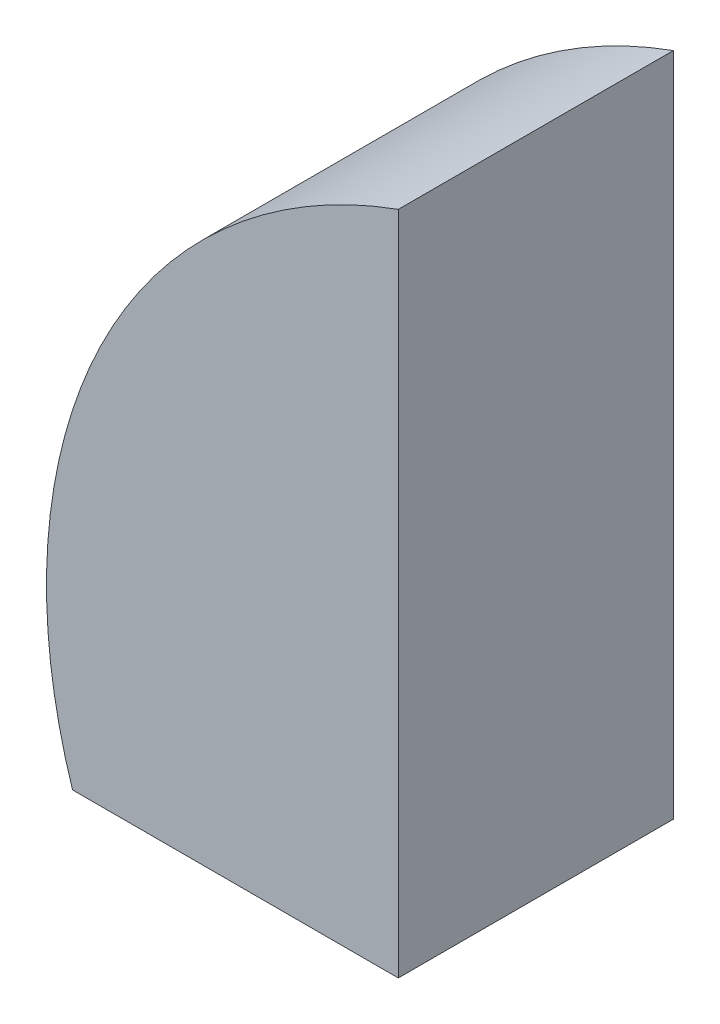
ISO-10303-21;
HEADER;
FILE_DESCRIPTION(('STEP AP214'),'2;1');
FILE_NAME('part.step','',(''),(''),'','','');
FILE_SCHEMA(('AUTOMOTIVE_DESIGN { 1 0 10303 214 1 1 1 1 }'));
ENDSEC;
DATA;
#1=APPLICATION_CONTEXT('core data for automotive mechanical design processes');
#2=APPLICATION_PROTOCOL_DEFINITION('international standard','automotive_design',2000,#1);
#3=PRODUCT_CONTEXT('',#1,'mechanical');
#4=PRODUCT('Part','Part','',(#3));
#5=PRODUCT_RELATED_PRODUCT_CATEGORY('part','',(#4));
#6=PRODUCT_DEFINITION_FORMATION('','',#4);
#7=PRODUCT_DEFINITION_CONTEXT('part definition',#1,'design');
#8=PRODUCT_DEFINITION('design','',#6,#7);
#9=PRODUCT_DEFINITION_SHAPE('','',#8);
#10=(LENGTH_UNIT() NAMED_UNIT(*) SI_UNIT(.MILLI.,.METRE.));
#11=(NAMED_UNIT(*) PLANE_ANGLE_UNIT() SI_UNIT($,.RADIAN.));
#12=(NAMED_UNIT(*) SI_UNIT($,.STERADIAN.) SOLID_ANGLE_UNIT());
#13=UNCERTAINTY_MEASURE_WITH_UNIT(LENGTH_MEASURE(1.E-05),#10,'distance_accuracy_value','');
#14=(GEOMETRIC_REPRESENTATION_CONTEXT(3) GLOBAL_UNCERTAINTY_ASSIGNED_CONTEXT((#13)) GLOBAL_UNIT_ASSIGNED_CONTEXT((#10,
#11,#12)) REPRESENTATION_CONTEXT('',''));
#15=CARTESIAN_POINT('',(0.,0.,0.));
#16=DIRECTION('',(0.,0.,1.));
#17=DIRECTION('',(1.,0.,0.));
#18=AXIS2_PLACEMENT_3D('',#15,#16,#17);
#19=CARTESIAN_POINT('',(-634.999999999999,-5.55111512312578E-13,965.199999999998));
#20=DIRECTION('',(0.999999999999999,0.,0.));
#21=DIRECTION('',(0.,1.,0.));
#22=AXIS2_PLACEMENT_3D('',#19,#20,#21);
#23=PLANE('',#22);
#24=DIRECTION('',(0.,-1.,0.));
#25=VECTOR('',#24,1.);
#26=CARTESIAN_POINT('',(-634.999999999999,-1.11022302462516E-13,0.));
#27=LINE('',#26,#25);
#28=CARTESIAN_POINT('',(-635.,1758.28920078581,0.));
#29=VERTEX_POINT('',#28);
#30=CARTESIAN_POINT('',(-634.999999999999,-577.513561399211,0.));
#31=VERTEX_POINT('',#30);
#32=EDGE_CURVE('E89',#29,#31,#27,.T.);
#33=ORIENTED_EDGE('',*,*,#32,.F.);
#34=DIRECTION('',(0.,0.,-0.999999999999999));
#35=VECTOR('',#34,1.);
#36=CARTESIAN_POINT('',(-635.,1758.28920078581,965.199999999998));
#37=LINE('',#36,#35);
#38=CARTESIAN_POINT('',(-635.,1758.28920078581,965.199999999998));
#39=VERTEX_POINT('',#38);
#40=EDGE_CURVE('E13',#39,#29,#37,.T.);
#41=ORIENTED_EDGE('',*,*,#40,.F.);
#42=DIRECTION('',(0.,-1.,0.));
#43=VECTOR('',#42,1.);
#44=CARTESIAN_POINT('',(-634.999999999999,-5.55111512312578E-13,965.199999999998));
#45=LINE('',#44,#43);
#46=CARTESIAN_POINT('',(-635.,-577.513561399211,965.199999999998));
#47=VERTEX_POINT('',#46);
#48=EDGE_CURVE('E87',#39,#47,#45,.T.);
#49=ORIENTED_EDGE('',*,*,#48,.T.);
#50=DIRECTION('',(0.,0.,-0.999999999999999));
#51=VECTOR('',#50,1.);
#52=CARTESIAN_POINT('',(-635.,-577.513561399211,965.199999999998));
#53=LINE('',#52,#51);
#54=EDGE_CURVE('E83',#47,#31,#53,.T.);
#55=ORIENTED_EDGE('',*,*,#54,.T.);
#56=EDGE_LOOP('',(#33,#41,#49,#55));
#57=FACE_BOUND('',#56,.T.);
#58=ADVANCED_FACE('F48',(#57),#23,.T.);
#59=CARTESIAN_POINT('',(0.,-4.44089209850063E-13,965.199999999998));
#60=DIRECTION('',(0.,0.,-0.999999999999999));
#61=DIRECTION('',(-1.,0.,0.));
#62=AXIS2_PLACEMENT_3D('',#59,#60,#61);
#63=CYLINDRICAL_SURFACE('',#62,1869.44);
#64=CARTESIAN_POINT('',(0.,0.,0.));
#65=DIRECTION('',(0.,0.,1.));
#66=DIRECTION('',(1.,0.,0.));
#67=AXIS2_PLACEMENT_3D('',#64,#65,#66);
#68=CIRCLE('',#67,1869.44);
#69=CARTESIAN_POINT('',(-1778.,-577.513561399211,0.));
#70=VERTEX_POINT('',#69);
#71=EDGE_CURVE('E77',#29,#70,#68,.T.);
#72=ORIENTED_EDGE('',*,*,#71,.T.);
#73=DIRECTION('',(0.,0.,-0.999999999999999));
#74=VECTOR('',#73,1.);
#75=CARTESIAN_POINT('',(-1778.,-577.513561399211,965.199999999998));
#76=LINE('',#75,#74);
#77=CARTESIAN_POINT('',(-1778.,-577.513561399211,965.199999999998));
#78=VERTEX_POINT('',#77);
#79=EDGE_CURVE('E57',#78,#70,#76,.T.);
#80=ORIENTED_EDGE('',*,*,#79,.F.);
#81=CARTESIAN_POINT('',(0.,-4.44089209850063E-13,965.199999999998));
#82=DIRECTION('',(0.,0.,1.));
#83=DIRECTION('',(1.,0.,0.));
#84=AXIS2_PLACEMENT_3D('',#81,#82,#83);
#85=CIRCLE('',#84,1869.44);
#86=EDGE_CURVE('E90',#39,#78,#85,.T.);
#87=ORIENTED_EDGE('',*,*,#86,.F.);
#88=ORIENTED_EDGE('',*,*,#40,.T.);
#89=EDGE_LOOP('',(#72,#80,#87,#88));
#90=FACE_BOUND('',#89,.T.);
#91=ADVANCED_FACE('F91',(#90),#63,.T.);
#92=CARTESIAN_POINT('',(0.,-577.513561399211,965.199999999998));
#93=DIRECTION('',(0.,1.,0.));
#94=DIRECTION('',(-1.,0.,0.));
#95=AXIS2_PLACEMENT_3D('',#92,#93,#94);
#96=PLANE('',#95);
#97=DIRECTION('',(1.,0.,0.));
#98=VECTOR('',#97,1.);
#99=CARTESIAN_POINT('',(0.,-577.513561399211,0.));
#100=LINE('',#99,#98);
#101=EDGE_CURVE('E96',#70,#31,#100,.T.);
#102=ORIENTED_EDGE('',*,*,#101,.T.);
#103=ORIENTED_EDGE('',*,*,#54,.F.);
#104=DIRECTION('',(1.,0.,0.));
#105=VECTOR('',#104,1.);
#106=CARTESIAN_POINT('',(0.,-577.513561399211,965.199999999998));
#107=LINE('',#106,#105);
#108=EDGE_CURVE('E65',#78,#47,#107,.T.);
#109=ORIENTED_EDGE('',*,*,#108,.F.);
#110=ORIENTED_EDGE('',*,*,#79,.T.);
#111=EDGE_LOOP('',(#102,#103,#109,#110));
#112=FACE_BOUND('',#111,.T.);
#113=ADVANCED_FACE('F113',(#112),#96,.F.);
#114=CARTESIAN_POINT('',(0.,-4.44089209850063E-13,965.199999999998));
#115=DIRECTION('',(0.,0.,1.));
#116=DIRECTION('',(1.,0.,0.));
#117=AXIS2_PLACEMENT_3D('',#114,#115,#116);
#118=PLANE('',#117);
#119=ORIENTED_EDGE('',*,*,#48,.F.);
#120=ORIENTED_EDGE('',*,*,#86,.T.);
#121=ORIENTED_EDGE('',*,*,#108,.T.);
#122=EDGE_LOOP('',(#119,#120,#121));
#123=FACE_BOUND('',#122,.T.);
#124=ADVANCED_FACE('F94',(#123),#118,.T.);
#125=CARTESIAN_POINT('',(0.,0.,0.));
#126=DIRECTION('',(0.,0.,1.));
#127=DIRECTION('',(1.,0.,0.));
#128=AXIS2_PLACEMENT_3D('',#125,#126,#127);
#129=PLANE('',#128);
#130=ORIENTED_EDGE('',*,*,#32,.T.);
#131=ORIENTED_EDGE('',*,*,#101,.F.);
#132=ORIENTED_EDGE('',*,*,#71,.F.);
#133=EDGE_LOOP('',(#130,#131,#132));
#134=FACE_BOUND('',#133,.T.);
#135=ADVANCED_FACE('F115',(#134),#129,.F.);
#136=CLOSED_SHELL('',(#58,#91,#113,#124,#135));
#137=MANIFOLD_SOLID_BREP('B2',#136);
#138=ADVANCED_BREP_SHAPE_REPRESENTATION('',(#18,#137),#14);
#139=SHAPE_DEFINITION_REPRESENTATION(#9,#138);
ENDSEC;
END-ISO-10303-21;
